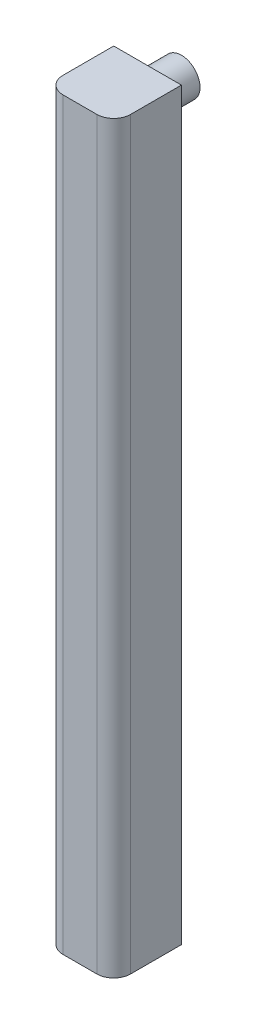
ISO-10303-21;
HEADER;
FILE_DESCRIPTION(('STEP AP214'),'2;1');
FILE_NAME('part.step','',(''),(''),'','','');
FILE_SCHEMA(('AUTOMOTIVE_DESIGN { 1 0 10303 214 1 1 1 1 }'));
ENDSEC;
DATA;
#1=APPLICATION_CONTEXT('core data for automotive mechanical design processes');
#2=APPLICATION_PROTOCOL_DEFINITION('international standard','automotive_design',2000,#1);
#3=PRODUCT_CONTEXT('',#1,'mechanical');
#4=PRODUCT('Part','Part','',(#3));
#5=PRODUCT_RELATED_PRODUCT_CATEGORY('part','',(#4));
#6=PRODUCT_DEFINITION_FORMATION('','',#4);
#7=PRODUCT_DEFINITION_CONTEXT('part definition',#1,'design');
#8=PRODUCT_DEFINITION('design','',#6,#7);
#9=PRODUCT_DEFINITION_SHAPE('','',#8);
#10=(LENGTH_UNIT() NAMED_UNIT(*) SI_UNIT(.MILLI.,.METRE.));
#11=(NAMED_UNIT(*) PLANE_ANGLE_UNIT() SI_UNIT($,.RADIAN.));
#12=(NAMED_UNIT(*) SI_UNIT($,.STERADIAN.) SOLID_ANGLE_UNIT());
#13=UNCERTAINTY_MEASURE_WITH_UNIT(LENGTH_MEASURE(1.E-05),#10,'distance_accuracy_value','');
#14=(GEOMETRIC_REPRESENTATION_CONTEXT(3) GLOBAL_UNCERTAINTY_ASSIGNED_CONTEXT((#13)) GLOBAL_UNIT_ASSIGNED_CONTEXT((#10,
#11,#12)) REPRESENTATION_CONTEXT('',''));
#15=CARTESIAN_POINT('',(0.,0.,0.));
#16=DIRECTION('',(0.,0.,1.));
#17=DIRECTION('',(1.,0.,0.));
#18=AXIS2_PLACEMENT_3D('',#15,#16,#17);
#19=CARTESIAN_POINT('',(10.,0.,10.));
#20=DIRECTION('',(0.,1.,0.));
#21=DIRECTION('',(0.,0.,1.));
#22=AXIS2_PLACEMENT_3D('',#19,#20,#21);
#23=PLANE('',#22);
#24=DIRECTION('',(1.,0.,0.));
#25=VECTOR('',#24,1.);
#26=CARTESIAN_POINT('',(10.,0.,10.));
#27=LINE('',#26,#25);
#28=CARTESIAN_POINT('',(2.5,0.,10.));
#29=VERTEX_POINT('',#28);
#30=CARTESIAN_POINT('',(7.5,0.,10.));
#31=VERTEX_POINT('',#30);
#32=EDGE_CURVE('E127',#29,#31,#27,.T.);
#33=ORIENTED_EDGE('',*,*,#32,.F.);
#34=CARTESIAN_POINT('',(2.5,0.,7.5));
#35=DIRECTION('',(0.,1.,0.));
#36=DIRECTION('',(0.,0.,1.));
#37=AXIS2_PLACEMENT_3D('',#34,#35,#36);
#38=CIRCLE('',#37,2.5);
#39=CARTESIAN_POINT('',(0.,0.,7.5));
#40=VERTEX_POINT('',#39);
#41=EDGE_CURVE('E139',#29,#40,#38,.F.);
#42=ORIENTED_EDGE('',*,*,#41,.T.);
#43=DIRECTION('',(0.,0.,-1.));
#44=VECTOR('',#43,1.);
#45=CARTESIAN_POINT('',(0.,0.,10.));
#46=LINE('',#45,#44);
#47=CARTESIAN_POINT('',(0.,0.,0.));
#48=VERTEX_POINT('',#47);
#49=EDGE_CURVE('E113',#40,#48,#46,.T.);
#50=ORIENTED_EDGE('',*,*,#49,.T.);
#51=DIRECTION('',(1.,0.,0.));
#52=VECTOR('',#51,1.);
#53=CARTESIAN_POINT('',(10.,0.,0.));
#54=LINE('',#53,#52);
#55=CARTESIAN_POINT('',(10.,0.,0.));
#56=VERTEX_POINT('',#55);
#57=EDGE_CURVE('E108',#48,#56,#54,.T.);
#58=ORIENTED_EDGE('',*,*,#57,.T.);
#59=DIRECTION('',(0.,0.,-1.));
#60=VECTOR('',#59,1.);
#61=CARTESIAN_POINT('',(10.,0.,10.));
#62=LINE('',#61,#60);
#63=CARTESIAN_POINT('',(10.,0.,7.5));
#64=VERTEX_POINT('',#63);
#65=EDGE_CURVE('E92',#64,#56,#62,.T.);
#66=ORIENTED_EDGE('',*,*,#65,.F.);
#67=CARTESIAN_POINT('',(7.5,0.,7.5));
#68=DIRECTION('',(0.,1.,0.));
#69=DIRECTION('',(0.,0.,1.));
#70=AXIS2_PLACEMENT_3D('',#67,#68,#69);
#71=CIRCLE('',#70,2.5);
#72=EDGE_CURVE('E137',#64,#31,#71,.F.);
#73=ORIENTED_EDGE('',*,*,#72,.T.);
#74=EDGE_LOOP('',(#33,#42,#50,#58,#66,#73));
#75=FACE_BOUND('',#74,.T.);
#76=ADVANCED_FACE('F39',(#75),#23,.F.);
#77=CARTESIAN_POINT('',(10.,110.,10.));
#78=DIRECTION('',(-1.,0.,0.));
#79=DIRECTION('',(0.,0.,1.));
#80=AXIS2_PLACEMENT_3D('',#77,#78,#79);
#81=PLANE('',#80);
#82=DIRECTION('',(0.,0.,-1.));
#83=VECTOR('',#82,1.);
#84=CARTESIAN_POINT('',(10.,110.,10.));
#85=LINE('',#84,#83);
#86=CARTESIAN_POINT('',(10.,110.,7.5));
#87=VERTEX_POINT('',#86);
#88=CARTESIAN_POINT('',(10.,110.,0.));
#89=VERTEX_POINT('',#88);
#90=EDGE_CURVE('E102',#87,#89,#85,.T.);
#91=ORIENTED_EDGE('',*,*,#90,.F.);
#92=DIRECTION('',(0.,1.,0.));
#93=VECTOR('',#92,1.);
#94=CARTESIAN_POINT('',(10.,110.,7.5));
#95=LINE('',#94,#93);
#96=EDGE_CURVE('E11',#87,#64,#95,.F.);
#97=ORIENTED_EDGE('',*,*,#96,.T.);
#98=ORIENTED_EDGE('',*,*,#65,.T.);
#99=DIRECTION('',(0.,1.,0.));
#100=VECTOR('',#99,1.);
#101=CARTESIAN_POINT('',(10.,110.,0.));
#102=LINE('',#101,#100);
#103=EDGE_CURVE('E95',#56,#89,#102,.T.);
#104=ORIENTED_EDGE('',*,*,#103,.T.);
#105=EDGE_LOOP('',(#91,#97,#98,#104));
#106=FACE_BOUND('',#105,.T.);
#107=ADVANCED_FACE('F94',(#106),#81,.F.);
#108=CARTESIAN_POINT('',(0.,110.,10.));
#109=DIRECTION('',(0.,-1.,0.));
#110=DIRECTION('',(0.,0.,-1.));
#111=AXIS2_PLACEMENT_3D('',#108,#109,#110);
#112=PLANE('',#111);
#113=DIRECTION('',(0.,0.,-1.));
#114=VECTOR('',#113,1.);
#115=CARTESIAN_POINT('',(0.,110.,10.));
#116=LINE('',#115,#114);
#117=CARTESIAN_POINT('',(0.,110.,7.5));
#118=VERTEX_POINT('',#117);
#119=CARTESIAN_POINT('',(0.,110.,0.));
#120=VERTEX_POINT('',#119);
#121=EDGE_CURVE('E129',#118,#120,#116,.T.);
#122=ORIENTED_EDGE('',*,*,#121,.F.);
#123=CARTESIAN_POINT('',(2.5,110.,7.5));
#124=DIRECTION('',(0.,-1.,0.));
#125=DIRECTION('',(0.,0.,-1.));
#126=AXIS2_PLACEMENT_3D('',#123,#124,#125);
#127=CIRCLE('',#126,2.5);
#128=CARTESIAN_POINT('',(2.5,110.,10.));
#129=VERTEX_POINT('',#128);
#130=EDGE_CURVE('E47',#118,#129,#127,.F.);
#131=ORIENTED_EDGE('',*,*,#130,.T.);
#132=DIRECTION('',(-1.,0.,0.));
#133=VECTOR('',#132,1.);
#134=CARTESIAN_POINT('',(0.,110.,10.));
#135=LINE('',#134,#133);
#136=CARTESIAN_POINT('',(7.5,110.,10.));
#137=VERTEX_POINT('',#136);
#138=EDGE_CURVE('E121',#137,#129,#135,.T.);
#139=ORIENTED_EDGE('',*,*,#138,.F.);
#140=CARTESIAN_POINT('',(7.5,110.,7.5));
#141=DIRECTION('',(0.,-1.,0.));
#142=DIRECTION('',(0.,0.,-1.));
#143=AXIS2_PLACEMENT_3D('',#140,#141,#142);
#144=CIRCLE('',#143,2.5);
#145=EDGE_CURVE('E54',#137,#87,#144,.F.);
#146=ORIENTED_EDGE('',*,*,#145,.T.);
#147=ORIENTED_EDGE('',*,*,#90,.T.);
#148=DIRECTION('',(-1.,0.,0.));
#149=VECTOR('',#148,1.);
#150=CARTESIAN_POINT('',(0.,110.,0.));
#151=LINE('',#150,#149);
#152=EDGE_CURVE('E110',#89,#120,#151,.T.);
#153=ORIENTED_EDGE('',*,*,#152,.T.);
#154=EDGE_LOOP('',(#122,#131,#139,#146,#147,#153));
#155=FACE_BOUND('',#154,.T.);
#156=ADVANCED_FACE('F144',(#155),#112,.F.);
#157=CARTESIAN_POINT('',(0.,0.,10.));
#158=DIRECTION('',(1.,0.,0.));
#159=DIRECTION('',(0.,0.,-1.));
#160=AXIS2_PLACEMENT_3D('',#157,#158,#159);
#161=PLANE('',#160);
#162=ORIENTED_EDGE('',*,*,#49,.F.);
#163=DIRECTION('',(0.,-1.,0.));
#164=VECTOR('',#163,1.);
#165=CARTESIAN_POINT('',(0.,0.,7.5));
#166=LINE('',#165,#164);
#167=EDGE_CURVE('E62',#40,#118,#166,.F.);
#168=ORIENTED_EDGE('',*,*,#167,.T.);
#169=ORIENTED_EDGE('',*,*,#121,.T.);
#170=DIRECTION('',(0.,-1.,0.));
#171=VECTOR('',#170,1.);
#172=CARTESIAN_POINT('',(0.,0.,0.));
#173=LINE('',#172,#171);
#174=EDGE_CURVE('E125',#120,#48,#173,.T.);
#175=ORIENTED_EDGE('',*,*,#174,.T.);
#176=EDGE_LOOP('',(#162,#168,#169,#175));
#177=FACE_BOUND('',#176,.T.);
#178=ADVANCED_FACE('F152',(#177),#161,.F.);
#179=CARTESIAN_POINT('',(0.,0.,10.));
#180=DIRECTION('',(0.,0.,-1.));
#181=DIRECTION('',(-1.,0.,0.));
#182=AXIS2_PLACEMENT_3D('',#179,#180,#181);
#183=PLANE('',#182);
#184=ORIENTED_EDGE('',*,*,#138,.T.);
#185=DIRECTION('',(0.,-1.,0.));
#186=VECTOR('',#185,1.);
#187=CARTESIAN_POINT('',(2.5,0.,10.));
#188=LINE('',#187,#186);
#189=EDGE_CURVE('E134',#129,#29,#188,.T.);
#190=ORIENTED_EDGE('',*,*,#189,.T.);
#191=ORIENTED_EDGE('',*,*,#32,.T.);
#192=DIRECTION('',(0.,1.,0.));
#193=VECTOR('',#192,1.);
#194=CARTESIAN_POINT('',(7.5,0.,10.));
#195=LINE('',#194,#193);
#196=EDGE_CURVE('E101',#31,#137,#195,.T.);
#197=ORIENTED_EDGE('',*,*,#196,.T.);
#198=EDGE_LOOP('',(#184,#190,#191,#197));
#199=FACE_BOUND('',#198,.T.);
#200=ADVANCED_FACE('F148',(#199),#183,.F.);
#201=CARTESIAN_POINT('',(0.,0.,0.));
#202=DIRECTION('',(0.,0.,-1.));
#203=DIRECTION('',(-1.,0.,0.));
#204=AXIS2_PLACEMENT_3D('',#201,#202,#203);
#205=PLANE('',#204);
#206=CARTESIAN_POINT('',(5.,106.074407223601,0.));
#207=DIRECTION('',(0.,0.,-1.));
#208=DIRECTION('',(-1.,0.,0.));
#209=AXIS2_PLACEMENT_3D('',#206,#207,#208);
#210=CIRCLE('',#209,2.75);
#211=CARTESIAN_POINT('',(2.25,106.074407223601,0.));
#212=VERTEX_POINT('',#211);
#213=EDGE_CURVE('E118',#212,#212,#210,.T.);
#214=ORIENTED_EDGE('',*,*,#213,.F.);
#215=EDGE_LOOP('',(#214));
#216=FACE_BOUND('',#215,.T.);
#217=ORIENTED_EDGE('',*,*,#57,.F.);
#218=ORIENTED_EDGE('',*,*,#174,.F.);
#219=ORIENTED_EDGE('',*,*,#152,.F.);
#220=ORIENTED_EDGE('',*,*,#103,.F.);
#221=EDGE_LOOP('',(#217,#218,#219,#220));
#222=FACE_BOUND('',#221,.T.);
#223=ADVANCED_FACE('F106',(#216,#222),#205,.T.);
#224=CARTESIAN_POINT('',(5.,106.074407223601,-5.));
#225=DIRECTION('',(0.,0.,1.));
#226=DIRECTION('',(1.,0.,0.));
#227=AXIS2_PLACEMENT_3D('',#224,#225,#226);
#228=CYLINDRICAL_SURFACE('',#227,2.75);
#229=CARTESIAN_POINT('',(5.,106.074407223601,-5.));
#230=DIRECTION('',(0.,0.,-1.));
#231=DIRECTION('',(-1.,0.,0.));
#232=AXIS2_PLACEMENT_3D('',#229,#230,#231);
#233=CIRCLE('',#232,2.75);
#234=CARTESIAN_POINT('',(2.25,106.074407223601,-5.));
#235=VERTEX_POINT('',#234);
#236=EDGE_CURVE('E115',#235,#235,#233,.T.);
#237=ORIENTED_EDGE('',*,*,#236,.F.);
#238=EDGE_LOOP('',(#237));
#239=FACE_BOUND('',#238,.T.);
#240=ORIENTED_EDGE('',*,*,#213,.T.);
#241=EDGE_LOOP('',(#240));
#242=FACE_BOUND('',#241,.T.);
#243=ADVANCED_FACE('F158',(#239,#242),#228,.T.);
#244=CARTESIAN_POINT('',(5.,106.074407223601,-5.));
#245=DIRECTION('',(0.,0.,-1.));
#246=DIRECTION('',(-1.,0.,0.));
#247=AXIS2_PLACEMENT_3D('',#244,#245,#246);
#248=PLANE('',#247);
#249=ORIENTED_EDGE('',*,*,#236,.T.);
#250=EDGE_LOOP('',(#249));
#251=FACE_BOUND('',#250,.T.);
#252=ADVANCED_FACE('F165',(#251),#248,.T.);
#253=CARTESIAN_POINT('',(2.5,0.,7.5));
#254=DIRECTION('',(0.,-1.,0.));
#255=DIRECTION('',(0.,0.,-1.));
#256=AXIS2_PLACEMENT_3D('',#253,#254,#255);
#257=CYLINDRICAL_SURFACE('',#256,2.5);
#258=ORIENTED_EDGE('',*,*,#130,.F.);
#259=ORIENTED_EDGE('',*,*,#167,.F.);
#260=ORIENTED_EDGE('',*,*,#41,.F.);
#261=ORIENTED_EDGE('',*,*,#189,.F.);
#262=EDGE_LOOP('',(#258,#259,#260,#261));
#263=FACE_BOUND('',#262,.T.);
#264=ADVANCED_FACE('F151',(#263),#257,.T.);
#265=CARTESIAN_POINT('',(7.5,0.,7.5));
#266=DIRECTION('',(0.,1.,0.));
#267=DIRECTION('',(0.,0.,1.));
#268=AXIS2_PLACEMENT_3D('',#265,#266,#267);
#269=CYLINDRICAL_SURFACE('',#268,2.5);
#270=ORIENTED_EDGE('',*,*,#72,.F.);
#271=ORIENTED_EDGE('',*,*,#96,.F.);
#272=ORIENTED_EDGE('',*,*,#145,.F.);
#273=ORIENTED_EDGE('',*,*,#196,.F.);
#274=EDGE_LOOP('',(#270,#271,#272,#273));
#275=FACE_BOUND('',#274,.T.);
#276=ADVANCED_FACE('F41',(#275),#269,.T.);
#277=CLOSED_SHELL('',(#76,#107,#156,#178,#200,#223,#243,#252,#264,#276));
#278=MANIFOLD_SOLID_BREP('B2',#277);
#279=ADVANCED_BREP_SHAPE_REPRESENTATION('',(#18,#278),#14);
#280=SHAPE_DEFINITION_REPRESENTATION(#9,#279);
ENDSEC;
END-ISO-10303-21;
